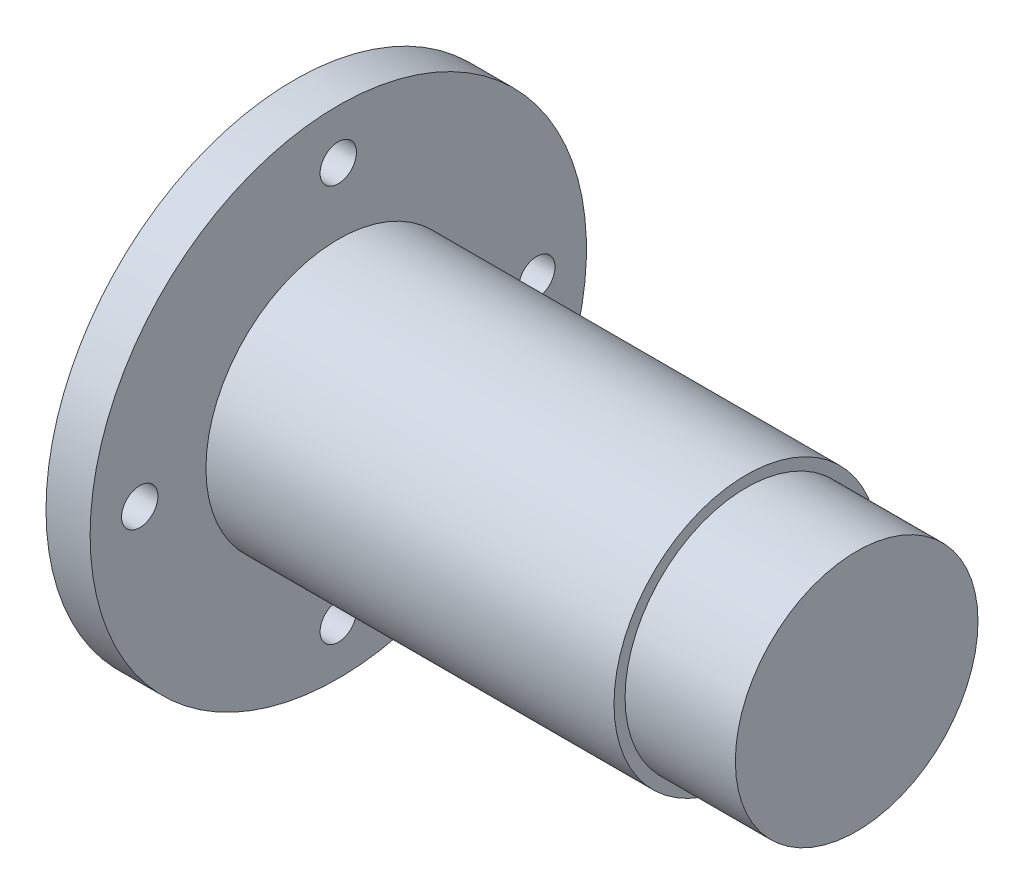
ISO-10303-21;
HEADER;
FILE_DESCRIPTION(('STEP AP214'),'2;1');
FILE_NAME('part.step','',(''),(''),'','','');
FILE_SCHEMA(('AUTOMOTIVE_DESIGN { 1 0 10303 214 1 1 1 1 }'));
ENDSEC;
DATA;
#1=APPLICATION_CONTEXT('core data for automotive mechanical design processes');
#2=APPLICATION_PROTOCOL_DEFINITION('international standard','automotive_design',2000,#1);
#3=PRODUCT_CONTEXT('',#1,'mechanical');
#4=PRODUCT('Part','Part','',(#3));
#5=PRODUCT_RELATED_PRODUCT_CATEGORY('part','',(#4));
#6=PRODUCT_DEFINITION_FORMATION('','',#4);
#7=PRODUCT_DEFINITION_CONTEXT('part definition',#1,'design');
#8=PRODUCT_DEFINITION('design','',#6,#7);
#9=PRODUCT_DEFINITION_SHAPE('','',#8);
#10=(LENGTH_UNIT() NAMED_UNIT(*) SI_UNIT(.MILLI.,.METRE.));
#11=(NAMED_UNIT(*) PLANE_ANGLE_UNIT() SI_UNIT($,.RADIAN.));
#12=(NAMED_UNIT(*) SI_UNIT($,.STERADIAN.) SOLID_ANGLE_UNIT());
#13=UNCERTAINTY_MEASURE_WITH_UNIT(LENGTH_MEASURE(1.E-05),#10,'distance_accuracy_value','');
#14=(GEOMETRIC_REPRESENTATION_CONTEXT(3) GLOBAL_UNCERTAINTY_ASSIGNED_CONTEXT((#13)) GLOBAL_UNIT_ASSIGNED_CONTEXT((#10,
#11,#12)) REPRESENTATION_CONTEXT('',''));
#15=CARTESIAN_POINT('',(0.,0.,0.));
#16=DIRECTION('',(0.,0.,1.));
#17=DIRECTION('',(1.,0.,0.));
#18=AXIS2_PLACEMENT_3D('',#15,#16,#17);
#19=CARTESIAN_POINT('',(30.,0.,0.));
#20=DIRECTION('',(1.,0.,0.));
#21=DIRECTION('',(0.,0.,-1.));
#22=AXIS2_PLACEMENT_3D('',#19,#20,#21);
#23=PLANE('',#22);
#24=CARTESIAN_POINT('',(30.,0.,0.));
#25=DIRECTION('',(1.,0.,0.));
#26=DIRECTION('',(0.,0.,-1.));
#27=AXIS2_PLACEMENT_3D('',#24,#25,#26);
#28=CIRCLE('',#27,10.);
#29=CARTESIAN_POINT('',(30.,0.,-10.));
#30=VERTEX_POINT('',#29);
#31=EDGE_CURVE('E11',#30,#30,#28,.F.);
#32=ORIENTED_EDGE('',*,*,#31,.F.);
#33=EDGE_LOOP('',(#32));
#34=FACE_BOUND('',#33,.T.);
#35=CARTESIAN_POINT('',(30.,0.,0.));
#36=DIRECTION('',(1.,0.,0.));
#37=DIRECTION('',(0.,0.,-1.));
#38=AXIS2_PLACEMENT_3D('',#35,#36,#37);
#39=CIRCLE('',#38,11.);
#40=CARTESIAN_POINT('',(30.,0.,-11.));
#41=VERTEX_POINT('',#40);
#42=EDGE_CURVE('E72',#41,#41,#39,.T.);
#43=ORIENTED_EDGE('',*,*,#42,.F.);
#44=EDGE_LOOP('',(#43));
#45=FACE_BOUND('',#44,.T.);
#46=ADVANCED_FACE('F58',(#34,#45),#23,.F.);
#47=CARTESIAN_POINT('',(39.,0.,0.));
#48=DIRECTION('',(-1.,0.,0.));
#49=DIRECTION('',(0.,0.,1.));
#50=AXIS2_PLACEMENT_3D('',#47,#48,#49);
#51=CYLINDRICAL_SURFACE('',#50,10.);
#52=CARTESIAN_POINT('',(39.,0.,0.));
#53=DIRECTION('',(1.,0.,0.));
#54=DIRECTION('',(0.,0.,-1.));
#55=AXIS2_PLACEMENT_3D('',#52,#53,#54);
#56=CIRCLE('',#55,10.);
#57=CARTESIAN_POINT('',(39.,0.,-10.));
#58=VERTEX_POINT('',#57);
#59=EDGE_CURVE('E64',#58,#58,#56,.T.);
#60=ORIENTED_EDGE('',*,*,#59,.T.);
#61=EDGE_LOOP('',(#60));
#62=FACE_BOUND('',#61,.T.);
#63=ORIENTED_EDGE('',*,*,#31,.T.);
#64=EDGE_LOOP('',(#63));
#65=FACE_BOUND('',#64,.T.);
#66=ADVANCED_FACE('F82',(#62,#65),#51,.F.);
#67=CARTESIAN_POINT('',(39.,0.,0.));
#68=DIRECTION('',(1.,0.,0.));
#69=DIRECTION('',(0.,0.,-1.));
#70=AXIS2_PLACEMENT_3D('',#67,#68,#69);
#71=PLANE('',#70);
#72=ORIENTED_EDGE('',*,*,#59,.F.);
#73=EDGE_LOOP('',(#72));
#74=FACE_BOUND('',#73,.T.);
#75=ADVANCED_FACE('F89',(#74),#71,.F.);
#76=CARTESIAN_POINT('',(0.,0.,0.));
#77=DIRECTION('',(-1.,0.,0.));
#78=DIRECTION('',(0.,0.,1.));
#79=AXIS2_PLACEMENT_3D('',#76,#77,#78);
#80=CYLINDRICAL_SURFACE('',#79,11.);
#81=ORIENTED_EDGE('',*,*,#42,.T.);
#82=EDGE_LOOP('',(#81));
#83=FACE_BOUND('',#82,.T.);
#84=CARTESIAN_POINT('',(40.,0.,0.));
#85=DIRECTION('',(-1.,0.,0.));
#86=DIRECTION('',(0.,0.,1.));
#87=AXIS2_PLACEMENT_3D('',#84,#85,#86);
#88=CIRCLE('',#87,11.);
#89=CARTESIAN_POINT('',(40.,0.,11.));
#90=VERTEX_POINT('',#89);
#91=EDGE_CURVE('E68',#90,#90,#88,.T.);
#92=ORIENTED_EDGE('',*,*,#91,.T.);
#93=EDGE_LOOP('',(#92));
#94=FACE_BOUND('',#93,.T.);
#95=ADVANCED_FACE('F78',(#83,#94),#80,.T.);
#96=CARTESIAN_POINT('',(40.,0.,0.));
#97=DIRECTION('',(1.,0.,0.));
#98=DIRECTION('',(0.,0.,-1.));
#99=AXIS2_PLACEMENT_3D('',#96,#97,#98);
#100=PLANE('',#99);
#101=ORIENTED_EDGE('',*,*,#91,.F.);
#102=EDGE_LOOP('',(#101));
#103=FACE_BOUND('',#102,.T.);
#104=ADVANCED_FACE('F97',(#103),#100,.T.);
#105=CLOSED_SHELL('',(#46,#66,#75,#95,#104));
#106=MANIFOLD_SOLID_BREP('B2',#105);
#107=CARTESIAN_POINT('',(-11.,10.,0.));
#108=DIRECTION('',(1.,0.,0.));
#109=DIRECTION('',(0.,0.,-1.));
#110=AXIS2_PLACEMENT_3D('',#107,#108,#109);
#111=PLANE('',#110);
#112=CARTESIAN_POINT('',(-11.,18.,0.));
#113=DIRECTION('',(-1.,0.,0.));
#114=DIRECTION('',(0.,0.,1.));
#115=AXIS2_PLACEMENT_3D('',#112,#113,#114);
#116=CIRCLE('',#115,1.64999999999999);
#117=CARTESIAN_POINT('',(-11.,18.,1.64999999999999));
#118=VERTEX_POINT('',#117);
#119=EDGE_CURVE('E184',#118,#118,#116,.T.);
#120=ORIENTED_EDGE('',*,*,#119,.F.);
#121=EDGE_LOOP('',(#120));
#122=FACE_BOUND('',#121,.T.);
#123=CARTESIAN_POINT('',(-11.,0.,18.));
#124=DIRECTION('',(-1.,0.,0.));
#125=DIRECTION('',(0.,0.,1.));
#126=AXIS2_PLACEMENT_3D('',#123,#124,#125);
#127=CIRCLE('',#126,1.64999999999999);
#128=CARTESIAN_POINT('',(-11.,0.,19.65));
#129=VERTEX_POINT('',#128);
#130=EDGE_CURVE('E174',#129,#129,#127,.T.);
#131=ORIENTED_EDGE('',*,*,#130,.F.);
#132=EDGE_LOOP('',(#131));
#133=FACE_BOUND('',#132,.T.);
#134=CARTESIAN_POINT('',(-11.,0.,-18.));
#135=DIRECTION('',(-1.,0.,0.));
#136=DIRECTION('',(0.,0.,1.));
#137=AXIS2_PLACEMENT_3D('',#134,#135,#136);
#138=CIRCLE('',#137,1.64999999999999);
#139=CARTESIAN_POINT('',(-11.,0.,-16.35));
#140=VERTEX_POINT('',#139);
#141=EDGE_CURVE('E170',#140,#140,#138,.T.);
#142=ORIENTED_EDGE('',*,*,#141,.F.);
#143=EDGE_LOOP('',(#142));
#144=FACE_BOUND('',#143,.T.);
#145=CARTESIAN_POINT('',(-11.,0.,0.));
#146=DIRECTION('',(1.,0.,0.));
#147=DIRECTION('',(0.,1.,0.));
#148=AXIS2_PLACEMENT_3D('',#145,#146,#147);
#149=CIRCLE('',#148,11.3);
#150=CARTESIAN_POINT('',(-11.,11.3,0.));
#151=VERTEX_POINT('',#150);
#152=EDGE_CURVE('E202',#151,#151,#149,.T.);
#153=ORIENTED_EDGE('',*,*,#152,.T.);
#154=EDGE_LOOP('',(#153));
#155=FACE_BOUND('',#154,.T.);
#156=CARTESIAN_POINT('',(-11.,0.,0.));
#157=DIRECTION('',(-1.,0.,0.));
#158=DIRECTION('',(0.,0.,1.));
#159=AXIS2_PLACEMENT_3D('',#156,#157,#158);
#160=CIRCLE('',#159,22.5);
#161=CARTESIAN_POINT('',(-11.,0.,22.5));
#162=VERTEX_POINT('',#161);
#163=EDGE_CURVE('E198',#162,#162,#160,.T.);
#164=ORIENTED_EDGE('',*,*,#163,.T.);
#165=EDGE_LOOP('',(#164));
#166=FACE_BOUND('',#165,.T.);
#167=CARTESIAN_POINT('',(-11.,-18.,0.));
#168=DIRECTION('',(-1.,0.,0.));
#169=DIRECTION('',(0.,0.,1.));
#170=AXIS2_PLACEMENT_3D('',#167,#168,#169);
#171=CIRCLE('',#170,1.64999999999999);
#172=CARTESIAN_POINT('',(-11.,-18.,1.64999999999999));
#173=VERTEX_POINT('',#172);
#174=EDGE_CURVE('E171',#173,#173,#171,.T.);
#175=ORIENTED_EDGE('',*,*,#174,.F.);
#176=EDGE_LOOP('',(#175));
#177=FACE_BOUND('',#176,.T.);
#178=ADVANCED_FACE('F151',(#122,#133,#144,#155,#166,#177),#111,.F.);
#179=CARTESIAN_POINT('',(-11.,0.,0.));
#180=DIRECTION('',(-1.,0.,0.));
#181=DIRECTION('',(0.,0.,1.));
#182=AXIS2_PLACEMENT_3D('',#179,#180,#181);
#183=CYLINDRICAL_SURFACE('',#182,12.);
#184=CARTESIAN_POINT('',(-7.,0.,0.));
#185=DIRECTION('',(-1.,0.,0.));
#186=DIRECTION('',(0.,0.,1.));
#187=AXIS2_PLACEMENT_3D('',#184,#185,#186);
#188=CIRCLE('',#187,12.);
#189=CARTESIAN_POINT('',(-7.,0.,12.));
#190=VERTEX_POINT('',#189);
#191=EDGE_CURVE('E57',#190,#190,#188,.T.);
#192=ORIENTED_EDGE('',*,*,#191,.F.);
#193=EDGE_LOOP('',(#192));
#194=FACE_BOUND('',#193,.T.);
#195=CARTESIAN_POINT('',(30.,0.,0.));
#196=DIRECTION('',(1.,0.,0.));
#197=DIRECTION('',(0.,0.,-1.));
#198=AXIS2_PLACEMENT_3D('',#195,#196,#197);
#199=CIRCLE('',#198,12.);
#200=CARTESIAN_POINT('',(30.,0.,-12.));
#201=VERTEX_POINT('',#200);
#202=EDGE_CURVE('E195',#201,#201,#199,.T.);
#203=ORIENTED_EDGE('',*,*,#202,.F.);
#204=EDGE_LOOP('',(#203));
#205=FACE_BOUND('',#204,.T.);
#206=ADVANCED_FACE('F224',(#194,#205),#183,.T.);
#207=CARTESIAN_POINT('',(-11.,0.,0.));
#208=DIRECTION('',(-1.,0.,0.));
#209=DIRECTION('',(0.,0.,1.));
#210=AXIS2_PLACEMENT_3D('',#207,#208,#209);
#211=CYLINDRICAL_SURFACE('',#210,10.);
#212=CARTESIAN_POINT('',(-9.9,0.,0.));
#213=DIRECTION('',(1.,0.,0.));
#214=DIRECTION('',(0.,1.,0.));
#215=AXIS2_PLACEMENT_3D('',#212,#213,#214);
#216=CIRCLE('',#215,10.);
#217=CARTESIAN_POINT('',(-9.9,10.,0.));
#218=VERTEX_POINT('',#217);
#219=EDGE_CURVE('E159',#218,#218,#216,.T.);
#220=ORIENTED_EDGE('',*,*,#219,.F.);
#221=EDGE_LOOP('',(#220));
#222=FACE_BOUND('',#221,.T.);
#223=CARTESIAN_POINT('',(30.,0.,0.));
#224=DIRECTION('',(1.,0.,0.));
#225=DIRECTION('',(0.,0.,-1.));
#226=AXIS2_PLACEMENT_3D('',#223,#224,#225);
#227=CIRCLE('',#226,10.);
#228=CARTESIAN_POINT('',(30.,0.,-10.));
#229=VERTEX_POINT('',#228);
#230=EDGE_CURVE('E192',#229,#229,#227,.T.);
#231=ORIENTED_EDGE('',*,*,#230,.T.);
#232=EDGE_LOOP('',(#231));
#233=FACE_BOUND('',#232,.T.);
#234=ADVANCED_FACE('F153',(#222,#233),#211,.F.);
#235=CARTESIAN_POINT('',(0.,0.,0.));
#236=DIRECTION('',(1.,0.,0.));
#237=DIRECTION('',(0.,1.,0.));
#238=AXIS2_PLACEMENT_3D('',#235,#236,#237);
#239=CYLINDRICAL_SURFACE('',#238,11.3);
#240=ORIENTED_EDGE('',*,*,#152,.F.);
#241=EDGE_LOOP('',(#240));
#242=FACE_BOUND('',#241,.T.);
#243=CARTESIAN_POINT('',(-10.4,0.,0.));
#244=DIRECTION('',(1.,0.,0.));
#245=DIRECTION('',(0.,1.,0.));
#246=AXIS2_PLACEMENT_3D('',#243,#244,#245);
#247=CIRCLE('',#246,11.3);
#248=CARTESIAN_POINT('',(-10.4,11.3,0.));
#249=VERTEX_POINT('',#248);
#250=EDGE_CURVE('E207',#249,#249,#247,.T.);
#251=ORIENTED_EDGE('',*,*,#250,.T.);
#252=EDGE_LOOP('',(#251));
#253=FACE_BOUND('',#252,.T.);
#254=ADVANCED_FACE('F223',(#242,#253),#239,.F.);
#255=CARTESIAN_POINT('',(-10.4,0.,0.));
#256=DIRECTION('',(1.,0.,0.));
#257=DIRECTION('',(0.,1.,0.));
#258=AXIS2_PLACEMENT_3D('',#255,#256,#257);
#259=TOROIDAL_SURFACE('',#258,11.8,0.5);
#260=ORIENTED_EDGE('',*,*,#250,.F.);
#261=EDGE_LOOP('',(#260));
#262=FACE_BOUND('',#261,.T.);
#263=CARTESIAN_POINT('',(-9.9,0.,0.));
#264=DIRECTION('',(1.,0.,0.));
#265=DIRECTION('',(0.,1.,0.));
#266=AXIS2_PLACEMENT_3D('',#263,#264,#265);
#267=CIRCLE('',#266,11.8);
#268=CARTESIAN_POINT('',(-9.9,11.8,0.));
#269=VERTEX_POINT('',#268);
#270=EDGE_CURVE('E164',#269,#269,#267,.T.);
#271=ORIENTED_EDGE('',*,*,#270,.T.);
#272=EDGE_LOOP('',(#271));
#273=FACE_BOUND('',#272,.T.);
#274=ADVANCED_FACE('F212',(#262,#273),#259,.T.);
#275=CARTESIAN_POINT('',(-9.9,10.,0.));
#276=DIRECTION('',(1.,0.,0.));
#277=DIRECTION('',(0.,1.,0.));
#278=AXIS2_PLACEMENT_3D('',#275,#276,#277);
#279=PLANE('',#278);
#280=ORIENTED_EDGE('',*,*,#270,.F.);
#281=EDGE_LOOP('',(#280));
#282=FACE_BOUND('',#281,.T.);
#283=ORIENTED_EDGE('',*,*,#219,.T.);
#284=EDGE_LOOP('',(#283));
#285=FACE_BOUND('',#284,.T.);
#286=ADVANCED_FACE('F214',(#282,#285),#279,.F.);
#287=CARTESIAN_POINT('',(-7.,0.,0.));
#288=DIRECTION('',(-1.,0.,0.));
#289=DIRECTION('',(0.,0.,1.));
#290=AXIS2_PLACEMENT_3D('',#287,#288,#289);
#291=CYLINDRICAL_SURFACE('',#290,22.5);
#292=CARTESIAN_POINT('',(-7.,0.,0.));
#293=DIRECTION('',(-1.,0.,0.));
#294=DIRECTION('',(0.,0.,1.));
#295=AXIS2_PLACEMENT_3D('',#292,#293,#294);
#296=CIRCLE('',#295,22.5);
#297=CARTESIAN_POINT('',(-7.,0.,22.5));
#298=VERTEX_POINT('',#297);
#299=EDGE_CURVE('E199',#298,#298,#296,.T.);
#300=ORIENTED_EDGE('',*,*,#299,.T.);
#301=EDGE_LOOP('',(#300));
#302=FACE_BOUND('',#301,.T.);
#303=ORIENTED_EDGE('',*,*,#163,.F.);
#304=EDGE_LOOP('',(#303));
#305=FACE_BOUND('',#304,.T.);
#306=ADVANCED_FACE('F217',(#302,#305),#291,.T.);
#307=CARTESIAN_POINT('',(-7.,0.,0.));
#308=DIRECTION('',(-1.,0.,0.));
#309=DIRECTION('',(0.,0.,1.));
#310=AXIS2_PLACEMENT_3D('',#307,#308,#309);
#311=PLANE('',#310);
#312=CARTESIAN_POINT('',(-7.,18.,0.));
#313=DIRECTION('',(-1.,0.,0.));
#314=DIRECTION('',(0.,0.,1.));
#315=AXIS2_PLACEMENT_3D('',#312,#313,#314);
#316=CIRCLE('',#315,1.64999999999999);
#317=CARTESIAN_POINT('',(-7.,18.,1.64999999999999));
#318=VERTEX_POINT('',#317);
#319=EDGE_CURVE('E155',#318,#318,#316,.T.);
#320=ORIENTED_EDGE('',*,*,#319,.T.);
#321=EDGE_LOOP('',(#320));
#322=FACE_BOUND('',#321,.T.);
#323=CARTESIAN_POINT('',(-7.,0.,18.));
#324=DIRECTION('',(-1.,0.,0.));
#325=DIRECTION('',(0.,0.,1.));
#326=AXIS2_PLACEMENT_3D('',#323,#324,#325);
#327=CIRCLE('',#326,1.64999999999999);
#328=CARTESIAN_POINT('',(-7.,0.,19.65));
#329=VERTEX_POINT('',#328);
#330=EDGE_CURVE('E172',#329,#329,#327,.T.);
#331=ORIENTED_EDGE('',*,*,#330,.T.);
#332=EDGE_LOOP('',(#331));
#333=FACE_BOUND('',#332,.T.);
#334=CARTESIAN_POINT('',(-7.,-18.,0.));
#335=DIRECTION('',(-1.,0.,0.));
#336=DIRECTION('',(0.,0.,1.));
#337=AXIS2_PLACEMENT_3D('',#334,#335,#336);
#338=CIRCLE('',#337,1.64999999999999);
#339=CARTESIAN_POINT('',(-7.,-18.,1.64999999999999));
#340=VERTEX_POINT('',#339);
#341=EDGE_CURVE('E168',#340,#340,#338,.T.);
#342=ORIENTED_EDGE('',*,*,#341,.T.);
#343=EDGE_LOOP('',(#342));
#344=FACE_BOUND('',#343,.T.);
#345=CARTESIAN_POINT('',(-7.,0.,-18.));
#346=DIRECTION('',(-1.,0.,0.));
#347=DIRECTION('',(0.,0.,1.));
#348=AXIS2_PLACEMENT_3D('',#345,#346,#347);
#349=CIRCLE('',#348,1.64999999999999);
#350=CARTESIAN_POINT('',(-7.,0.,-16.35));
#351=VERTEX_POINT('',#350);
#352=EDGE_CURVE('E189',#351,#351,#349,.T.);
#353=ORIENTED_EDGE('',*,*,#352,.T.);
#354=EDGE_LOOP('',(#353));
#355=FACE_BOUND('',#354,.T.);
#356=ORIENTED_EDGE('',*,*,#191,.T.);
#357=EDGE_LOOP('',(#356));
#358=FACE_BOUND('',#357,.T.);
#359=ORIENTED_EDGE('',*,*,#299,.F.);
#360=EDGE_LOOP('',(#359));
#361=FACE_BOUND('',#360,.T.);
#362=ADVANCED_FACE('F230',(#322,#333,#344,#355,#358,#361),#311,.F.);
#363=CARTESIAN_POINT('',(30.,0.,0.));
#364=DIRECTION('',(1.,0.,0.));
#365=DIRECTION('',(0.,0.,-1.));
#366=AXIS2_PLACEMENT_3D('',#363,#364,#365);
#367=PLANE('',#366);
#368=ORIENTED_EDGE('',*,*,#202,.T.);
#369=EDGE_LOOP('',(#368));
#370=FACE_BOUND('',#369,.T.);
#371=ORIENTED_EDGE('',*,*,#230,.F.);
#372=EDGE_LOOP('',(#371));
#373=FACE_BOUND('',#372,.T.);
#374=ADVANCED_FACE('F227',(#370,#373),#367,.T.);
#375=CARTESIAN_POINT('',(-11.,0.,-18.));
#376=DIRECTION('',(-1.,0.,0.));
#377=DIRECTION('',(0.,0.,1.));
#378=AXIS2_PLACEMENT_3D('',#375,#376,#377);
#379=CYLINDRICAL_SURFACE('',#378,1.64999999999999);
#380=ORIENTED_EDGE('',*,*,#141,.T.);
#381=EDGE_LOOP('',(#380));
#382=FACE_BOUND('',#381,.T.);
#383=ORIENTED_EDGE('',*,*,#352,.F.);
#384=EDGE_LOOP('',(#383));
#385=FACE_BOUND('',#384,.T.);
#386=ADVANCED_FACE('F229',(#382,#385),#379,.F.);
#387=CARTESIAN_POINT('',(-11.,-18.,0.));
#388=DIRECTION('',(-1.,0.,0.));
#389=DIRECTION('',(0.,0.,1.));
#390=AXIS2_PLACEMENT_3D('',#387,#388,#389);
#391=CYLINDRICAL_SURFACE('',#390,1.64999999999999);
#392=ORIENTED_EDGE('',*,*,#174,.T.);
#393=EDGE_LOOP('',(#392));
#394=FACE_BOUND('',#393,.T.);
#395=ORIENTED_EDGE('',*,*,#341,.F.);
#396=EDGE_LOOP('',(#395));
#397=FACE_BOUND('',#396,.T.);
#398=ADVANCED_FACE('F238',(#394,#397),#391,.F.);
#399=CARTESIAN_POINT('',(-11.,0.,18.));
#400=DIRECTION('',(-1.,0.,0.));
#401=DIRECTION('',(0.,0.,1.));
#402=AXIS2_PLACEMENT_3D('',#399,#400,#401);
#403=CYLINDRICAL_SURFACE('',#402,1.64999999999999);
#404=ORIENTED_EDGE('',*,*,#130,.T.);
#405=EDGE_LOOP('',(#404));
#406=FACE_BOUND('',#405,.T.);
#407=ORIENTED_EDGE('',*,*,#330,.F.);
#408=EDGE_LOOP('',(#407));
#409=FACE_BOUND('',#408,.T.);
#410=ADVANCED_FACE('F273',(#406,#409),#403,.F.);
#411=CARTESIAN_POINT('',(-11.,18.,0.));
#412=DIRECTION('',(-1.,0.,0.));
#413=DIRECTION('',(0.,0.,1.));
#414=AXIS2_PLACEMENT_3D('',#411,#412,#413);
#415=CYLINDRICAL_SURFACE('',#414,1.64999999999999);
#416=ORIENTED_EDGE('',*,*,#119,.T.);
#417=EDGE_LOOP('',(#416));
#418=FACE_BOUND('',#417,.T.);
#419=ORIENTED_EDGE('',*,*,#319,.F.);
#420=EDGE_LOOP('',(#419));
#421=FACE_BOUND('',#420,.T.);
#422=ADVANCED_FACE('F284',(#418,#421),#415,.F.);
#423=CLOSED_SHELL('',(#178,#206,#234,#254,#274,#286,#306,#362,#374,#386,#398,#410,#422));
#424=MANIFOLD_SOLID_BREP('B6',#423);
#425=CARTESIAN_POINT('',(-11.,10.,0.));
#426=DIRECTION('',(1.,0.,0.));
#427=DIRECTION('',(0.,0.,-1.));
#428=AXIS2_PLACEMENT_3D('',#425,#426,#427);
#429=PLANE('',#428);
#430=CARTESIAN_POINT('',(-11.,0.,0.));
#431=DIRECTION('',(-1.,0.,0.));
#432=DIRECTION('',(0.,0.,1.));
#433=AXIS2_PLACEMENT_3D('',#430,#431,#432);
#434=CIRCLE('',#433,10.);
#435=CARTESIAN_POINT('',(-11.,0.,10.));
#436=VERTEX_POINT('',#435);
#437=EDGE_CURVE('E150',#436,#436,#434,.T.);
#438=ORIENTED_EDGE('',*,*,#437,.F.);
#439=EDGE_LOOP('',(#438));
#440=FACE_BOUND('',#439,.T.);
#441=CARTESIAN_POINT('',(-11.,0.,0.));
#442=DIRECTION('',(1.,0.,0.));
#443=DIRECTION('',(0.,1.,0.));
#444=AXIS2_PLACEMENT_3D('',#441,#442,#443);
#445=CIRCLE('',#444,10.5);
#446=CARTESIAN_POINT('',(-11.,10.5,0.));
#447=VERTEX_POINT('',#446);
#448=EDGE_CURVE('E489',#447,#447,#445,.T.);
#449=ORIENTED_EDGE('',*,*,#448,.F.);
#450=EDGE_LOOP('',(#449));
#451=FACE_BOUND('',#450,.T.);
#452=ADVANCED_FACE('F474',(#440,#451),#429,.F.);
#453=CARTESIAN_POINT('',(-11.,0.,0.));
#454=DIRECTION('',(-1.,0.,0.));
#455=DIRECTION('',(0.,0.,1.));
#456=AXIS2_PLACEMENT_3D('',#453,#454,#455);
#457=CYLINDRICAL_SURFACE('',#456,10.);
#458=CARTESIAN_POINT('',(-9.9,0.,0.));
#459=DIRECTION('',(1.,0.,0.));
#460=DIRECTION('',(0.,1.,0.));
#461=AXIS2_PLACEMENT_3D('',#458,#459,#460);
#462=CIRCLE('',#461,10.);
#463=CARTESIAN_POINT('',(-9.9,10.,0.));
#464=VERTEX_POINT('',#463);
#465=EDGE_CURVE('E481',#464,#464,#462,.T.);
#466=ORIENTED_EDGE('',*,*,#465,.T.);
#467=EDGE_LOOP('',(#466));
#468=FACE_BOUND('',#467,.T.);
#469=ORIENTED_EDGE('',*,*,#437,.T.);
#470=EDGE_LOOP('',(#469));
#471=FACE_BOUND('',#470,.T.);
#472=ADVANCED_FACE('F476',(#468,#471),#457,.F.);
#473=CARTESIAN_POINT('',(0.,0.,0.));
#474=DIRECTION('',(1.,0.,0.));
#475=DIRECTION('',(0.,1.,0.));
#476=AXIS2_PLACEMENT_3D('',#473,#474,#475);
#477=CYLINDRICAL_SURFACE('',#476,10.5);
#478=CARTESIAN_POINT('',(-10.4,0.,0.));
#479=DIRECTION('',(1.,0.,0.));
#480=DIRECTION('',(0.,1.,0.));
#481=AXIS2_PLACEMENT_3D('',#478,#479,#480);
#482=CIRCLE('',#481,10.5);
#483=CARTESIAN_POINT('',(-10.4,10.5,0.));
#484=VERTEX_POINT('',#483);
#485=EDGE_CURVE('E485',#484,#484,#482,.T.);
#486=ORIENTED_EDGE('',*,*,#485,.F.);
#487=EDGE_LOOP('',(#486));
#488=FACE_BOUND('',#487,.T.);
#489=ORIENTED_EDGE('',*,*,#448,.T.);
#490=EDGE_LOOP('',(#489));
#491=FACE_BOUND('',#490,.T.);
#492=ADVANCED_FACE('F495',(#488,#491),#477,.T.);
#493=CARTESIAN_POINT('',(-10.4,0.,0.));
#494=DIRECTION('',(1.,0.,0.));
#495=DIRECTION('',(0.,1.,0.));
#496=AXIS2_PLACEMENT_3D('',#493,#494,#495);
#497=TOROIDAL_SURFACE('',#496,10.,0.5);
#498=ORIENTED_EDGE('',*,*,#465,.F.);
#499=EDGE_LOOP('',(#498));
#500=FACE_BOUND('',#499,.T.);
#501=ORIENTED_EDGE('',*,*,#485,.T.);
#502=EDGE_LOOP('',(#501));
#503=FACE_BOUND('',#502,.T.);
#504=ADVANCED_FACE('F503',(#500,#503),#497,.T.);
#505=CLOSED_SHELL('',(#452,#472,#492,#504));
#506=MANIFOLD_SOLID_BREP('B52',#505);
#507=ADVANCED_BREP_SHAPE_REPRESENTATION('',(#18,#106,#424,#506),#14);
#508=SHAPE_DEFINITION_REPRESENTATION(#9,#507);
ENDSEC;
END-ISO-10303-21;
